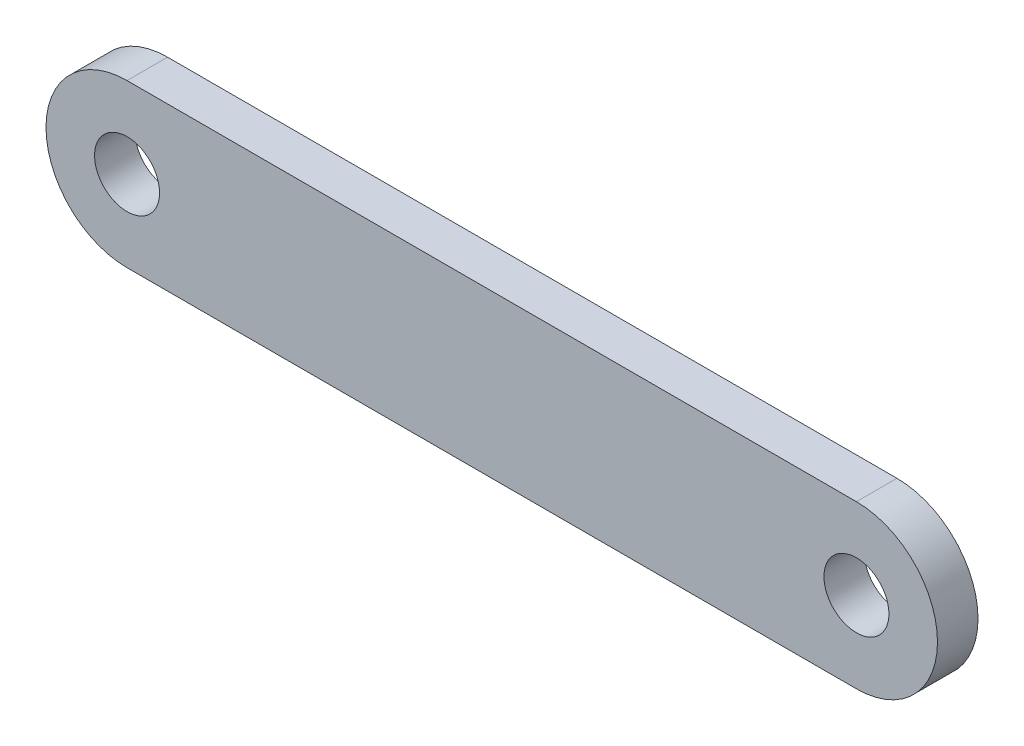
ISO-10303-21;
HEADER;
FILE_DESCRIPTION(('STEP AP214'),'2;1');
FILE_NAME('part.step','',(''),(''),'','','');
FILE_SCHEMA(('AUTOMOTIVE_DESIGN { 1 0 10303 214 1 1 1 1 }'));
ENDSEC;
DATA;
#1=APPLICATION_CONTEXT('core data for automotive mechanical design processes');
#2=APPLICATION_PROTOCOL_DEFINITION('international standard','automotive_design',2000,#1);
#3=PRODUCT_CONTEXT('',#1,'mechanical');
#4=PRODUCT('Part','Part','',(#3));
#5=PRODUCT_RELATED_PRODUCT_CATEGORY('part','',(#4));
#6=PRODUCT_DEFINITION_FORMATION('','',#4);
#7=PRODUCT_DEFINITION_CONTEXT('part definition',#1,'design');
#8=PRODUCT_DEFINITION('design','',#6,#7);
#9=PRODUCT_DEFINITION_SHAPE('','',#8);
#10=(LENGTH_UNIT() NAMED_UNIT(*) SI_UNIT(.MILLI.,.METRE.));
#11=(NAMED_UNIT(*) PLANE_ANGLE_UNIT() SI_UNIT($,.RADIAN.));
#12=(NAMED_UNIT(*) SI_UNIT($,.STERADIAN.) SOLID_ANGLE_UNIT());
#13=UNCERTAINTY_MEASURE_WITH_UNIT(LENGTH_MEASURE(1.E-05),#10,'distance_accuracy_value','');
#14=(GEOMETRIC_REPRESENTATION_CONTEXT(3) GLOBAL_UNCERTAINTY_ASSIGNED_CONTEXT((#13)) GLOBAL_UNIT_ASSIGNED_CONTEXT((#10,
#11,#12)) REPRESENTATION_CONTEXT('',''));
#15=CARTESIAN_POINT('',(0.,0.,0.));
#16=DIRECTION('',(0.,0.,1.));
#17=DIRECTION('',(1.,0.,0.));
#18=AXIS2_PLACEMENT_3D('',#15,#16,#17);
#19=CARTESIAN_POINT('',(0.,0.,5.));
#20=DIRECTION('',(0.,0.,-1.));
#21=DIRECTION('',(-1.,0.,0.));
#22=AXIS2_PLACEMENT_3D('',#19,#20,#21);
#23=CYLINDRICAL_SURFACE('',#22,10.);
#24=CARTESIAN_POINT('',(0.,0.,0.));
#25=DIRECTION('',(0.,0.,1.));
#26=DIRECTION('',(1.,0.,0.));
#27=AXIS2_PLACEMENT_3D('',#24,#25,#26);
#28=CIRCLE('',#27,10.);
#29=CARTESIAN_POINT('',(0.,10.,0.));
#30=VERTEX_POINT('',#29);
#31=CARTESIAN_POINT('',(0.,-10.,0.));
#32=VERTEX_POINT('',#31);
#33=EDGE_CURVE('E105',#30,#32,#28,.T.);
#34=ORIENTED_EDGE('',*,*,#33,.T.);
#35=DIRECTION('',(0.,0.,-1.));
#36=VECTOR('',#35,1.);
#37=CARTESIAN_POINT('',(0.,-10.,5.));
#38=LINE('',#37,#36);
#39=CARTESIAN_POINT('',(0.,-10.,5.));
#40=VERTEX_POINT('',#39);
#41=EDGE_CURVE('E11',#40,#32,#38,.T.);
#42=ORIENTED_EDGE('',*,*,#41,.F.);
#43=CARTESIAN_POINT('',(0.,0.,5.));
#44=DIRECTION('',(0.,0.,1.));
#45=DIRECTION('',(1.,0.,0.));
#46=AXIS2_PLACEMENT_3D('',#43,#44,#45);
#47=CIRCLE('',#46,10.);
#48=CARTESIAN_POINT('',(0.,10.,5.));
#49=VERTEX_POINT('',#48);
#50=EDGE_CURVE('E90',#49,#40,#47,.T.);
#51=ORIENTED_EDGE('',*,*,#50,.F.);
#52=DIRECTION('',(0.,0.,-1.));
#53=VECTOR('',#52,1.);
#54=CARTESIAN_POINT('',(0.,10.,5.));
#55=LINE('',#54,#53);
#56=EDGE_CURVE('E57',#49,#30,#55,.T.);
#57=ORIENTED_EDGE('',*,*,#56,.T.);
#58=EDGE_LOOP('',(#34,#42,#51,#57));
#59=FACE_BOUND('',#58,.T.);
#60=ADVANCED_FACE('F39',(#59),#23,.T.);
#61=CARTESIAN_POINT('',(0.,-10.,5.));
#62=DIRECTION('',(0.,1.,0.));
#63=DIRECTION('',(0.,0.,1.));
#64=AXIS2_PLACEMENT_3D('',#61,#62,#63);
#65=PLANE('',#64);
#66=DIRECTION('',(1.,0.,0.));
#67=VECTOR('',#66,1.);
#68=CARTESIAN_POINT('',(0.,-10.,0.));
#69=LINE('',#68,#67);
#70=CARTESIAN_POINT('',(90.,-10.,0.));
#71=VERTEX_POINT('',#70);
#72=EDGE_CURVE('E95',#32,#71,#69,.T.);
#73=ORIENTED_EDGE('',*,*,#72,.T.);
#74=DIRECTION('',(0.,0.,-1.));
#75=VECTOR('',#74,1.);
#76=CARTESIAN_POINT('',(90.,-10.,5.));
#77=LINE('',#76,#75);
#78=CARTESIAN_POINT('',(90.,-10.,5.));
#79=VERTEX_POINT('',#78);
#80=EDGE_CURVE('E48',#79,#71,#77,.T.);
#81=ORIENTED_EDGE('',*,*,#80,.F.);
#82=DIRECTION('',(1.,0.,0.));
#83=VECTOR('',#82,1.);
#84=CARTESIAN_POINT('',(0.,-10.,5.));
#85=LINE('',#84,#83);
#86=EDGE_CURVE('E83',#40,#79,#85,.T.);
#87=ORIENTED_EDGE('',*,*,#86,.F.);
#88=ORIENTED_EDGE('',*,*,#41,.T.);
#89=EDGE_LOOP('',(#73,#81,#87,#88));
#90=FACE_BOUND('',#89,.T.);
#91=ADVANCED_FACE('F94',(#90),#65,.F.);
#92=CARTESIAN_POINT('',(90.,0.,5.));
#93=DIRECTION('',(0.,0.,-1.));
#94=DIRECTION('',(-1.,0.,0.));
#95=AXIS2_PLACEMENT_3D('',#92,#93,#94);
#96=CYLINDRICAL_SURFACE('',#95,9.99999999999999);
#97=CARTESIAN_POINT('',(90.,0.,0.));
#98=DIRECTION('',(0.,0.,1.));
#99=DIRECTION('',(1.,0.,0.));
#100=AXIS2_PLACEMENT_3D('',#97,#98,#99);
#101=CIRCLE('',#100,9.99999999999999);
#102=CARTESIAN_POINT('',(90.,10.,0.));
#103=VERTEX_POINT('',#102);
#104=EDGE_CURVE('E108',#71,#103,#101,.T.);
#105=ORIENTED_EDGE('',*,*,#104,.T.);
#106=DIRECTION('',(0.,0.,-1.));
#107=VECTOR('',#106,1.);
#108=CARTESIAN_POINT('',(90.,10.,5.));
#109=LINE('',#108,#107);
#110=CARTESIAN_POINT('',(90.,10.,5.));
#111=VERTEX_POINT('',#110);
#112=EDGE_CURVE('E72',#111,#103,#109,.T.);
#113=ORIENTED_EDGE('',*,*,#112,.F.);
#114=CARTESIAN_POINT('',(90.,0.,5.));
#115=DIRECTION('',(0.,0.,1.));
#116=DIRECTION('',(1.,0.,0.));
#117=AXIS2_PLACEMENT_3D('',#114,#115,#116);
#118=CIRCLE('',#117,9.99999999999999);
#119=EDGE_CURVE('E89',#79,#111,#118,.T.);
#120=ORIENTED_EDGE('',*,*,#119,.F.);
#121=ORIENTED_EDGE('',*,*,#80,.T.);
#122=EDGE_LOOP('',(#105,#113,#120,#121));
#123=FACE_BOUND('',#122,.T.);
#124=ADVANCED_FACE('F99',(#123),#96,.T.);
#125=CARTESIAN_POINT('',(0.,10.,5.));
#126=DIRECTION('',(0.,1.,0.));
#127=DIRECTION('',(-1.,0.,0.));
#128=AXIS2_PLACEMENT_3D('',#125,#126,#127);
#129=PLANE('',#128);
#130=DIRECTION('',(1.,0.,0.));
#131=VECTOR('',#130,1.);
#132=CARTESIAN_POINT('',(0.,10.,0.));
#133=LINE('',#132,#131);
#134=EDGE_CURVE('E110',#30,#103,#133,.T.);
#135=ORIENTED_EDGE('',*,*,#134,.F.);
#136=ORIENTED_EDGE('',*,*,#56,.F.);
#137=DIRECTION('',(1.,0.,0.));
#138=VECTOR('',#137,1.);
#139=CARTESIAN_POINT('',(0.,10.,5.));
#140=LINE('',#139,#138);
#141=EDGE_CURVE('E100',#49,#111,#140,.T.);
#142=ORIENTED_EDGE('',*,*,#141,.T.);
#143=ORIENTED_EDGE('',*,*,#112,.T.);
#144=EDGE_LOOP('',(#135,#136,#142,#143));
#145=FACE_BOUND('',#144,.T.);
#146=ADVANCED_FACE('F134',(#145),#129,.T.);
#147=CARTESIAN_POINT('',(0.,0.,5.));
#148=DIRECTION('',(0.,0.,1.));
#149=DIRECTION('',(1.,0.,0.));
#150=AXIS2_PLACEMENT_3D('',#147,#148,#149);
#151=PLANE('',#150);
#152=CARTESIAN_POINT('',(0.,0.,5.));
#153=DIRECTION('',(0.,0.,1.));
#154=DIRECTION('',(1.,0.,0.));
#155=AXIS2_PLACEMENT_3D('',#152,#153,#154);
#156=CIRCLE('',#155,4.01);
#157=CARTESIAN_POINT('',(4.01,0.,5.));
#158=VERTEX_POINT('',#157);
#159=EDGE_CURVE('E116',#158,#158,#156,.T.);
#160=ORIENTED_EDGE('',*,*,#159,.F.);
#161=EDGE_LOOP('',(#160));
#162=FACE_BOUND('',#161,.T.);
#163=CARTESIAN_POINT('',(90.,0.,5.));
#164=DIRECTION('',(0.,0.,1.));
#165=DIRECTION('',(1.,0.,0.));
#166=AXIS2_PLACEMENT_3D('',#163,#164,#165);
#167=CIRCLE('',#166,4.01);
#168=CARTESIAN_POINT('',(94.01,0.,5.));
#169=VERTEX_POINT('',#168);
#170=EDGE_CURVE('E121',#169,#169,#167,.T.);
#171=ORIENTED_EDGE('',*,*,#170,.F.);
#172=EDGE_LOOP('',(#171));
#173=FACE_BOUND('',#172,.T.);
#174=ORIENTED_EDGE('',*,*,#50,.T.);
#175=ORIENTED_EDGE('',*,*,#86,.T.);
#176=ORIENTED_EDGE('',*,*,#119,.T.);
#177=ORIENTED_EDGE('',*,*,#141,.F.);
#178=EDGE_LOOP('',(#174,#175,#176,#177));
#179=FACE_BOUND('',#178,.T.);
#180=ADVANCED_FACE('F86',(#162,#173,#179),#151,.T.);
#181=CARTESIAN_POINT('',(0.,0.,0.));
#182=DIRECTION('',(0.,0.,1.));
#183=DIRECTION('',(1.,0.,0.));
#184=AXIS2_PLACEMENT_3D('',#181,#182,#183);
#185=PLANE('',#184);
#186=CARTESIAN_POINT('',(0.,0.,0.));
#187=DIRECTION('',(0.,0.,1.));
#188=DIRECTION('',(1.,0.,0.));
#189=AXIS2_PLACEMENT_3D('',#186,#187,#188);
#190=CIRCLE('',#189,4.01);
#191=CARTESIAN_POINT('',(4.01,0.,0.));
#192=VERTEX_POINT('',#191);
#193=EDGE_CURVE('E42',#192,#192,#190,.T.);
#194=ORIENTED_EDGE('',*,*,#193,.T.);
#195=EDGE_LOOP('',(#194));
#196=FACE_BOUND('',#195,.T.);
#197=CARTESIAN_POINT('',(90.,0.,0.));
#198=DIRECTION('',(0.,0.,1.));
#199=DIRECTION('',(1.,0.,0.));
#200=AXIS2_PLACEMENT_3D('',#197,#198,#199);
#201=CIRCLE('',#200,4.01);
#202=CARTESIAN_POINT('',(94.01,0.,0.));
#203=VERTEX_POINT('',#202);
#204=EDGE_CURVE('E114',#203,#203,#201,.T.);
#205=ORIENTED_EDGE('',*,*,#204,.T.);
#206=EDGE_LOOP('',(#205));
#207=FACE_BOUND('',#206,.T.);
#208=ORIENTED_EDGE('',*,*,#33,.F.);
#209=ORIENTED_EDGE('',*,*,#134,.T.);
#210=ORIENTED_EDGE('',*,*,#104,.F.);
#211=ORIENTED_EDGE('',*,*,#72,.F.);
#212=EDGE_LOOP('',(#208,#209,#210,#211));
#213=FACE_BOUND('',#212,.T.);
#214=ADVANCED_FACE('F133',(#196,#207,#213),#185,.F.);
#215=CARTESIAN_POINT('',(90.,0.,-5.));
#216=DIRECTION('',(0.,0.,1.));
#217=DIRECTION('',(1.,0.,0.));
#218=AXIS2_PLACEMENT_3D('',#215,#216,#217);
#219=CYLINDRICAL_SURFACE('',#218,4.01);
#220=ORIENTED_EDGE('',*,*,#170,.T.);
#221=EDGE_LOOP('',(#220));
#222=FACE_BOUND('',#221,.T.);
#223=ORIENTED_EDGE('',*,*,#204,.F.);
#224=EDGE_LOOP('',(#223));
#225=FACE_BOUND('',#224,.T.);
#226=ADVANCED_FACE('F129',(#222,#225),#219,.F.);
#227=CARTESIAN_POINT('',(0.,0.,-5.));
#228=DIRECTION('',(0.,0.,1.));
#229=DIRECTION('',(1.,0.,0.));
#230=AXIS2_PLACEMENT_3D('',#227,#228,#229);
#231=CYLINDRICAL_SURFACE('',#230,4.01);
#232=ORIENTED_EDGE('',*,*,#159,.T.);
#233=EDGE_LOOP('',(#232));
#234=FACE_BOUND('',#233,.T.);
#235=ORIENTED_EDGE('',*,*,#193,.F.);
#236=EDGE_LOOP('',(#235));
#237=FACE_BOUND('',#236,.T.);
#238=ADVANCED_FACE('F183',(#234,#237),#231,.F.);
#239=CLOSED_SHELL('',(#60,#91,#124,#146,#180,#214,#226,#238));
#240=MANIFOLD_SOLID_BREP('B2',#239);
#241=ADVANCED_BREP_SHAPE_REPRESENTATION('',(#18,#240),#14);
#242=SHAPE_DEFINITION_REPRESENTATION(#9,#241);
ENDSEC;
END-ISO-10303-21;
